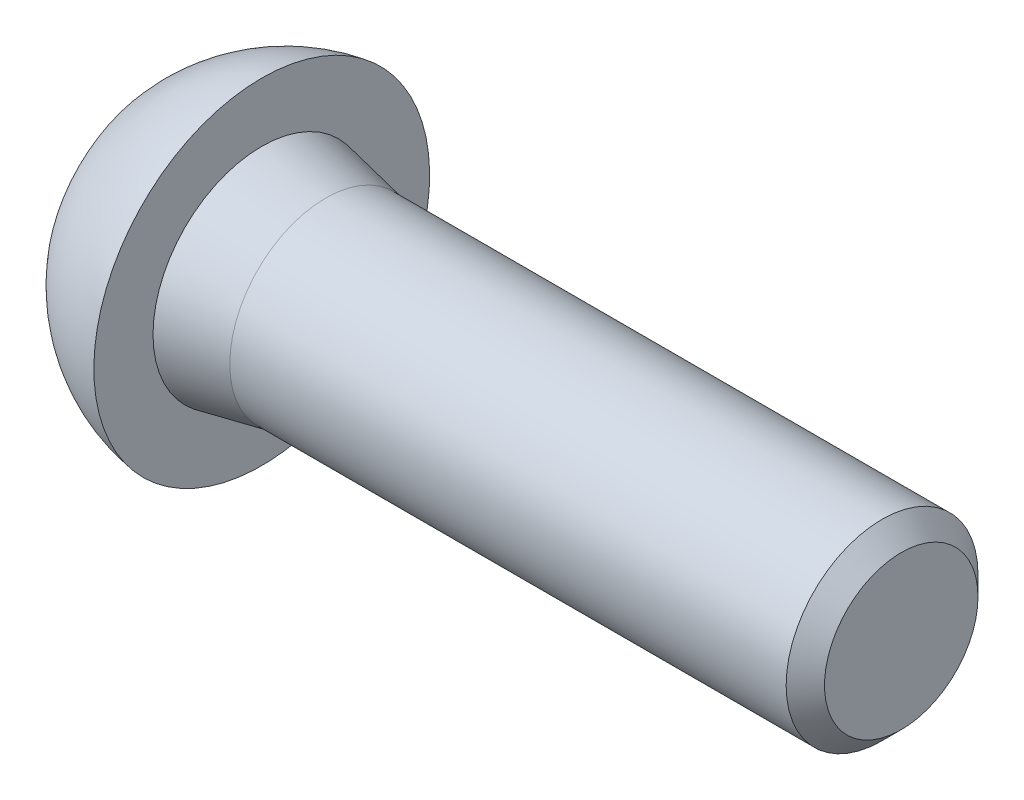
ISO-10303-21;
HEADER;
FILE_DESCRIPTION(('STEP AP214'),'2;1');
FILE_NAME('part.step','',(''),(''),'','','');
FILE_SCHEMA(('AUTOMOTIVE_DESIGN { 1 0 10303 214 1 1 1 1 }'));
ENDSEC;
DATA;
#1=APPLICATION_CONTEXT('core data for automotive mechanical design processes');
#2=APPLICATION_PROTOCOL_DEFINITION('international standard','automotive_design',2000,#1);
#3=PRODUCT_CONTEXT('',#1,'mechanical');
#4=PRODUCT('Part','Part','',(#3));
#5=PRODUCT_RELATED_PRODUCT_CATEGORY('part','',(#4));
#6=PRODUCT_DEFINITION_FORMATION('','',#4);
#7=PRODUCT_DEFINITION_CONTEXT('part definition',#1,'design');
#8=PRODUCT_DEFINITION('design','',#6,#7);
#9=PRODUCT_DEFINITION_SHAPE('','',#8);
#10=(LENGTH_UNIT() NAMED_UNIT(*) SI_UNIT(.MILLI.,.METRE.));
#11=(NAMED_UNIT(*) PLANE_ANGLE_UNIT() SI_UNIT($,.RADIAN.));
#12=(NAMED_UNIT(*) SI_UNIT($,.STERADIAN.) SOLID_ANGLE_UNIT());
#13=UNCERTAINTY_MEASURE_WITH_UNIT(LENGTH_MEASURE(1.E-05),#10,'distance_accuracy_value','');
#14=(GEOMETRIC_REPRESENTATION_CONTEXT(3) GLOBAL_UNCERTAINTY_ASSIGNED_CONTEXT((#13)) GLOBAL_UNIT_ASSIGNED_CONTEXT((#10,
#11,#12)) REPRESENTATION_CONTEXT('',''));
#15=CARTESIAN_POINT('',(0.,0.,0.));
#16=DIRECTION('',(0.,0.,1.));
#17=DIRECTION('',(1.,0.,0.));
#18=AXIS2_PLACEMENT_3D('',#15,#16,#17);
#19=CARTESIAN_POINT('',(0.,0.,0.));
#20=DIRECTION('',(1.,0.,0.));
#21=DIRECTION('',(0.,0.,-1.));
#22=AXIS2_PLACEMENT_3D('',#19,#20,#21);
#23=PLANE('',#22);
#24=CARTESIAN_POINT('',(0.,0.,0.));
#25=DIRECTION('',(1.,0.,0.));
#26=DIRECTION('',(0.,0.,-1.));
#27=AXIS2_PLACEMENT_3D('',#24,#25,#26);
#28=CIRCLE('',#27,2.4);
#29=CARTESIAN_POINT('',(0.,0.,-2.4));
#30=VERTEX_POINT('',#29);
#31=EDGE_CURVE('E62',#30,#30,#28,.T.);
#32=ORIENTED_EDGE('',*,*,#31,.T.);
#33=EDGE_LOOP('',(#32));
#34=FACE_BOUND('',#33,.T.);
#35=ADVANCED_FACE('F51',(#34),#23,.T.);
#36=CARTESIAN_POINT('',(0.,0.,0.));
#37=DIRECTION('',(1.,0.,0.));
#38=DIRECTION('',(0.,0.,-1.));
#39=AXIS2_PLACEMENT_3D('',#36,#37,#38);
#40=CYLINDRICAL_SURFACE('',#39,3.);
#41=CARTESIAN_POINT('',(-0.599999999999997,0.,0.));
#42=DIRECTION('',(1.,0.,0.));
#43=DIRECTION('',(0.,0.,-1.));
#44=AXIS2_PLACEMENT_3D('',#41,#42,#43);
#45=CIRCLE('',#44,3.);
#46=CARTESIAN_POINT('',(-0.599999999999997,0.,-3.));
#47=VERTEX_POINT('',#46);
#48=EDGE_CURVE('E12',#47,#47,#45,.F.);
#49=ORIENTED_EDGE('',*,*,#48,.T.);
#50=EDGE_LOOP('',(#49));
#51=FACE_BOUND('',#50,.T.);
#52=CARTESIAN_POINT('',(-18.,0.,0.));
#53=DIRECTION('',(1.,0.,0.));
#54=DIRECTION('',(0.,0.,-1.));
#55=AXIS2_PLACEMENT_3D('',#52,#53,#54);
#56=CIRCLE('',#55,3.);
#57=CARTESIAN_POINT('',(-18.,0.,-3.));
#58=VERTEX_POINT('',#57);
#59=EDGE_CURVE('E179',#58,#58,#56,.T.);
#60=ORIENTED_EDGE('',*,*,#59,.T.);
#61=EDGE_LOOP('',(#60));
#62=FACE_BOUND('',#61,.T.);
#63=ADVANCED_FACE('F255',(#51,#62),#40,.T.);
#64=CARTESIAN_POINT('',(-18.,0.,0.));
#65=DIRECTION('',(-1.,0.,0.));
#66=DIRECTION('',(0.,0.,1.));
#67=AXIS2_PLACEMENT_3D('',#64,#65,#66);
#68=CONICAL_SURFACE('',#67,3.,0.19739555984988);
#69=CARTESIAN_POINT('',(-20.,0.,0.));
#70=DIRECTION('',(1.,0.,0.));
#71=DIRECTION('',(0.,0.,-1.));
#72=AXIS2_PLACEMENT_3D('',#69,#70,#71);
#73=CIRCLE('',#72,3.4);
#74=CARTESIAN_POINT('',(-20.,0.,-3.4));
#75=VERTEX_POINT('',#74);
#76=EDGE_CURVE('E175',#75,#75,#73,.T.);
#77=ORIENTED_EDGE('',*,*,#76,.T.);
#78=EDGE_LOOP('',(#77));
#79=FACE_BOUND('',#78,.T.);
#80=ORIENTED_EDGE('',*,*,#59,.F.);
#81=EDGE_LOOP('',(#80));
#82=FACE_BOUND('',#81,.T.);
#83=ADVANCED_FACE('F259',(#79,#82),#68,.T.);
#84=CARTESIAN_POINT('',(-20.,3.4,0.));
#85=DIRECTION('',(1.,0.,0.));
#86=DIRECTION('',(0.,0.,-1.));
#87=AXIS2_PLACEMENT_3D('',#84,#85,#86);
#88=PLANE('',#87);
#89=CARTESIAN_POINT('',(-20.,0.,0.));
#90=DIRECTION('',(1.,0.,0.));
#91=DIRECTION('',(0.,0.,-1.));
#92=AXIS2_PLACEMENT_3D('',#89,#90,#91);
#93=CIRCLE('',#92,5.25);
#94=CARTESIAN_POINT('',(-20.,5.25,0.));
#95=VERTEX_POINT('',#94);
#96=EDGE_CURVE('E171',#95,#95,#93,.T.);
#97=ORIENTED_EDGE('',*,*,#96,.T.);
#98=EDGE_LOOP('',(#97));
#99=FACE_BOUND('',#98,.T.);
#100=ORIENTED_EDGE('',*,*,#76,.F.);
#101=EDGE_LOOP('',(#100));
#102=FACE_BOUND('',#101,.T.);
#103=ADVANCED_FACE('F265',(#99,#102),#88,.T.);
#104=CARTESIAN_POINT('',(-19.2460454545454,0.,0.));
#105=DIRECTION('',(1.,0.,0.));
#106=DIRECTION('',(0.,1.,0.));
#107=AXIS2_PLACEMENT_3D('',#104,#105,#106);
#108=SPHERICAL_SURFACE('',#107,5.30386156084523);
#109=CARTESIAN_POINT('',(-23.3,0.,0.));
#110=DIRECTION('',(1.,0.,0.));
#111=DIRECTION('',(0.,0.,-1.));
#112=AXIS2_PLACEMENT_3D('',#109,#110,#111);
#113=CIRCLE('',#112,3.41999999999999);
#114=CARTESIAN_POINT('',(-23.3,3.41999999999999,0.));
#115=VERTEX_POINT('',#114);
#116=EDGE_CURVE('E130',#115,#115,#113,.T.);
#117=CARTESIAN_POINT('',(-23.3,3.41999999999999,0.));
#118=CARTESIAN_POINT('',(-23.2740870694515,3.45071645963646,0.));
#119=CARTESIAN_POINT('',(-23.2478249112314,3.48113829921276,0.));
#120=CARTESIAN_POINT('',(-23.1946159870787,3.5413772668339,0.));
#121=CARTESIAN_POINT('',(-23.1676692211461,3.57119439487874,0.));
#122=CARTESIAN_POINT('',(-23.1131049291991,3.63020846802579,0.));
#123=CARTESIAN_POINT('',(-23.0854874031847,3.65940541312801,0.));
#124=CARTESIAN_POINT('',(-23.0295958800378,3.71716405311965,0.));
#125=CARTESIAN_POINT('',(-23.0013218829053,3.74572574800907,0.));
#126=CARTESIAN_POINT('',(-22.9441320202645,3.80219912608321,0.));
#127=CARTESIAN_POINT('',(-22.9152161547562,3.83011080926792,0.));
#128=CARTESIAN_POINT('',(-22.8567574965401,3.8852697442878,0.));
#129=CARTESIAN_POINT('',(-22.8272147038322,3.91251699612297,0.));
#130=CARTESIAN_POINT('',(-22.7675174544793,3.96633299047506,0.));
#131=CARTESIAN_POINT('',(-22.7373629978344,3.99290173299199,0.));
#132=CARTESIAN_POINT('',(-22.6764580003821,4.04534698173061,0.));
#133=CARTESIAN_POINT('',(-22.6457074595749,4.07122348795232,0.));
#134=CARTESIAN_POINT('',(-22.5836261814162,4.12227089466032,0.));
#135=CARTESIAN_POINT('',(-22.5522954440647,4.14744179514662,0.));
#136=CARTESIAN_POINT('',(-22.4890699602365,4.1970649855345,0.));
#137=CARTESIAN_POINT('',(-22.4571752137598,4.22151727543608,0.));
#138=CARTESIAN_POINT('',(-22.3928381904927,4.26969061107593,0.));
#139=CARTESIAN_POINT('',(-22.3603959137024,4.2934116568142,0.));
#140=CARTESIAN_POINT('',(-22.2949805915108,4.34011024835735,0.));
#141=CARTESIAN_POINT('',(-22.2620075461095,4.36308779416223,0.));
#142=CARTESIAN_POINT('',(-22.1955477226259,4.40828751420635,0.));
#143=CARTESIAN_POINT('',(-22.1620609445435,4.43050968844559,0.));
#144=CARTESIAN_POINT('',(-22.0945909570544,4.47418718399834,0.));
#145=CARTESIAN_POINT('',(-22.0606077476476,4.49564250531186,0.));
#146=CARTESIAN_POINT('',(-21.9921624553533,4.53777520985705,0.));
#147=CARTESIAN_POINT('',(-21.9577003724658,4.55845259308873,0.));
#148=CARTESIAN_POINT('',(-21.8883151384699,4.59901873824546,0.));
#149=CARTESIAN_POINT('',(-21.8533919873614,4.61890750017051,0.));
#150=CARTESIAN_POINT('',(-21.7831026603999,4.65788612694009,0.));
#151=CARTESIAN_POINT('',(-21.7477364845468,4.67697599178461,0.));
#152=CARTESIAN_POINT('',(-21.6765793804665,4.71434696137926,0.));
#153=CARTESIAN_POINT('',(-21.6407884522392,4.73262806612939,0.));
#154=CARTESIAN_POINT('',(-21.5688003352346,4.76837207037724,0.));
#155=CARTESIAN_POINT('',(-21.5326031464572,4.78583496987497,0.));
#156=CARTESIAN_POINT('',(-21.4598212100758,4.81993354119586,0.));
#157=CARTESIAN_POINT('',(-21.4232364624719,4.83656921301902,0.));
#158=CARTESIAN_POINT('',(-21.3496983103979,4.86900473396591,0.));
#159=CARTESIAN_POINT('',(-21.312744905928,4.88480458308965,0.));
#160=CARTESIAN_POINT('',(-21.2384885325538,4.91556029545117,0.));
#161=CARTESIAN_POINT('',(-21.2011855636496,4.93051615868895,0.));
#162=CARTESIAN_POINT('',(-21.1262493344453,4.95957617214685,0.));
#163=CARTESIAN_POINT('',(-21.0886160741452,4.97368032236698,0.));
#164=CARTESIAN_POINT('',(-21.0130387058371,5.0010296227092,0.));
#165=CARTESIAN_POINT('',(-20.9750945978292,5.01427477283129,0.));
#166=CARTESIAN_POINT('',(-20.8989151383947,5.0398992296977,0.));
#167=CARTESIAN_POINT('',(-20.8606797869681,5.05227853644201,0.));
#168=CARTESIAN_POINT('',(-20.783937595468,5.07616491066791,0.));
#169=CARTESIAN_POINT('',(-20.7454307553943,5.0876719781495,0.));
#170=CARTESIAN_POINT('',(-20.6681654816106,5.10980792844589,0.));
#171=CARTESIAN_POINT('',(-20.6294070479005,5.12043681126069,0.));
#172=CARTESIAN_POINT('',(-20.5516586119508,5.14081090118733,0.));
#173=CARTESIAN_POINT('',(-20.5126686097112,5.15055610829917,0.));
#174=CARTESIAN_POINT('',(-20.4344771810517,5.1691578099461,0.));
#175=CARTESIAN_POINT('',(-20.3952757546318,5.17801430448119,0.));
#176=CARTESIAN_POINT('',(-20.3166817326903,5.19483401222037,0.));
#177=CARTESIAN_POINT('',(-20.2772891371688,5.20279722542447,0.));
#178=CARTESIAN_POINT('',(-20.1983331252948,5.21782622985084,0.));
#179=CARTESIAN_POINT('',(-20.1587697089425,5.22489202107312,0.));
#180=CARTESIAN_POINT('',(-20.0794925127506,5.2381226292794,0.));
#181=CARTESIAN_POINT('',(-20.0397787329111,5.24428744626339,0.));
#182=CARTESIAN_POINT('',(-20.,5.25,0.));
#183=B_SPLINE_CURVE_WITH_KNOTS('',3,(#117,#118,#119,#120,#121,#122,#123,#124,#125,#126,#127,
#128,#129,#130,#131,#132,#133,#134,#135,#136,#137,#138,#139,#140,#141,#142,#143,#144,#145,#146,
#147,#148,#149,#150,#151,#152,#153,#154,#155,#156,#157,#158,#159,#160,#161,#162,#163,#164,#165,
#166,#167,#168,#169,#170,#171,#172,#173,#174,#175,#176,#177,#178,#179,#180,#181,#182),
.UNSPECIFIED.,.F.,.F.,(4,2,2,2,2,2,2,2,2,2,2,2,2,2,2,2,2,2,2,2,2,2,2,2,2,2,2,2,2,2,2,2,4),(0.,
0.120557872383614,0.241115744767229,0.361673617150845,0.482231489534458,0.602789361918074,
0.72334723430169,0.843905106685305,0.964462979068921,1.08502085145253,1.20557872383615,
1.32613659621976,1.44669446860338,1.567252340987,1.68781021337061,1.80836808575423,
1.92892595813784,2.04948383052145,2.17004170290507,2.29059957528868,2.4111574476723,
2.53171532005591,2.65227319243953,2.77283106482315,2.89338893720676,3.01394680959038,
3.13450468197399,3.2550625543576,3.37562042674122,3.49617829912484,3.61673617150845,
3.73729404389207,3.85785191627568),.UNSPECIFIED.);
#184=EDGE_CURVE('BSEAM269',#115,#95,#183,.T.);
#185=ORIENTED_EDGE('',*,*,#116,.T.);
#186=ORIENTED_EDGE('',*,*,#96,.F.);
#187=ORIENTED_EDGE('',*,*,#184,.T.);
#188=ORIENTED_EDGE('',*,*,#184,.F.);
#189=EDGE_LOOP('',(#185,#187,#186,#188));
#190=FACE_BOUND('',#189,.T.);
#191=ADVANCED_FACE('F269',(#190),#108,.T.);
#192=CARTESIAN_POINT('',(-23.3,3.42,0.));
#193=DIRECTION('',(-1.,0.,0.));
#194=DIRECTION('',(0.,0.,1.));
#195=AXIS2_PLACEMENT_3D('',#192,#193,#194);
#196=PLANE('',#195);
#197=DIRECTION('',(0.,0.5,-0.866025403784439));
#198=VECTOR('',#197,1.);
#199=CARTESIAN_POINT('',(-23.3,1.15470053837925,2.));
#200=LINE('',#199,#198);
#201=CARTESIAN_POINT('',(-23.3,1.15470053837925,2.));
#202=VERTEX_POINT('',#201);
#203=CARTESIAN_POINT('',(-23.3,2.3094010767585,0.));
#204=VERTEX_POINT('',#203);
#205=EDGE_CURVE('E71',#202,#204,#200,.T.);
#206=ORIENTED_EDGE('',*,*,#205,.F.);
#207=DIRECTION('',(0.,1.,0.));
#208=VECTOR('',#207,1.);
#209=CARTESIAN_POINT('',(-23.3,-1.15470053837925,2.));
#210=LINE('',#209,#208);
#211=CARTESIAN_POINT('',(-23.3,-1.15470053837925,2.));
#212=VERTEX_POINT('',#211);
#213=EDGE_CURVE('E133',#212,#202,#210,.T.);
#214=ORIENTED_EDGE('',*,*,#213,.F.);
#215=DIRECTION('',(0.,0.5,0.866025403784439));
#216=VECTOR('',#215,1.);
#217=CARTESIAN_POINT('',(-23.3,-2.3094010767585,0.));
#218=LINE('',#217,#216);
#219=CARTESIAN_POINT('',(-23.3,-2.3094010767585,0.));
#220=VERTEX_POINT('',#219);
#221=EDGE_CURVE('E138',#220,#212,#218,.T.);
#222=ORIENTED_EDGE('',*,*,#221,.F.);
#223=DIRECTION('',(0.,-0.5,0.866025403784439));
#224=VECTOR('',#223,1.);
#225=CARTESIAN_POINT('',(-23.3,-1.15470053837925,-2.));
#226=LINE('',#225,#224);
#227=CARTESIAN_POINT('',(-23.3,-1.15470053837925,-2.));
#228=VERTEX_POINT('',#227);
#229=EDGE_CURVE('E162',#228,#220,#226,.T.);
#230=ORIENTED_EDGE('',*,*,#229,.F.);
#231=DIRECTION('',(0.,-1.,0.));
#232=VECTOR('',#231,1.);
#233=CARTESIAN_POINT('',(-23.3,1.15470053837925,-2.));
#234=LINE('',#233,#232);
#235=CARTESIAN_POINT('',(-23.3,1.15470053837925,-2.));
#236=VERTEX_POINT('',#235);
#237=EDGE_CURVE('E152',#236,#228,#234,.T.);
#238=ORIENTED_EDGE('',*,*,#237,.F.);
#239=DIRECTION('',(0.,-0.5,-0.866025403784439));
#240=VECTOR('',#239,1.);
#241=CARTESIAN_POINT('',(-23.3,2.3094010767585,0.));
#242=LINE('',#241,#240);
#243=EDGE_CURVE('E145',#204,#236,#242,.T.);
#244=ORIENTED_EDGE('',*,*,#243,.F.);
#245=EDGE_LOOP('',(#206,#214,#222,#230,#238,#244));
#246=FACE_BOUND('',#245,.T.);
#247=ORIENTED_EDGE('',*,*,#116,.F.);
#248=EDGE_LOOP('',(#247));
#249=FACE_BOUND('',#248,.T.);
#250=ADVANCED_FACE('F141',(#246,#249),#196,.T.);
#251=CARTESIAN_POINT('',(-21.22,1.15470053837925,2.));
#252=DIRECTION('',(0.,0.866025403784439,0.5));
#253=DIRECTION('',(0.,-0.5,0.866025403784439));
#254=AXIS2_PLACEMENT_3D('',#251,#252,#253);
#255=PLANE('',#254);
#256=ORIENTED_EDGE('',*,*,#205,.T.);
#257=DIRECTION('',(-1.,0.,0.));
#258=VECTOR('',#257,1.);
#259=CARTESIAN_POINT('',(-21.22,2.3094010767585,0.));
#260=LINE('',#259,#258);
#261=CARTESIAN_POINT('',(-21.22,2.3094010767585,0.));
#262=VERTEX_POINT('',#261);
#263=EDGE_CURVE('E189',#262,#204,#260,.T.);
#264=ORIENTED_EDGE('',*,*,#263,.F.);
#265=DIRECTION('',(0.,-0.5,0.866025403784438));
#266=VECTOR('',#265,1.);
#267=CARTESIAN_POINT('',(-21.22,2.3094010767585,0.));
#268=LINE('',#267,#266);
#269=CARTESIAN_POINT('',(-21.22,1.15470053837925,2.));
#270=VERTEX_POINT('',#269);
#271=EDGE_CURVE('E55',#270,#262,#268,.F.);
#272=ORIENTED_EDGE('',*,*,#271,.F.);
#273=DIRECTION('',(-1.,0.,0.));
#274=VECTOR('',#273,1.);
#275=CARTESIAN_POINT('',(-21.22,1.15470053837925,2.));
#276=LINE('',#275,#274);
#277=EDGE_CURVE('E127',#270,#202,#276,.T.);
#278=ORIENTED_EDGE('',*,*,#277,.T.);
#279=EDGE_LOOP('',(#256,#264,#272,#278));
#280=FACE_BOUND('',#279,.T.);
#281=ADVANCED_FACE('F128',(#280),#255,.F.);
#282=CARTESIAN_POINT('',(-21.22,-1.15470053837925,2.));
#283=DIRECTION('',(0.,0.,1.));
#284=DIRECTION('',(1.,0.,0.));
#285=AXIS2_PLACEMENT_3D('',#282,#283,#284);
#286=PLANE('',#285);
#287=ORIENTED_EDGE('',*,*,#213,.T.);
#288=ORIENTED_EDGE('',*,*,#277,.F.);
#289=DIRECTION('',(0.,1.,0.));
#290=VECTOR('',#289,1.);
#291=CARTESIAN_POINT('',(-21.22,0.,2.));
#292=LINE('',#291,#290);
#293=CARTESIAN_POINT('',(-21.22,-1.15470053837925,2.));
#294=VERTEX_POINT('',#293);
#295=EDGE_CURVE('E95',#294,#270,#292,.T.);
#296=ORIENTED_EDGE('',*,*,#295,.F.);
#297=DIRECTION('',(-1.,0.,0.));
#298=VECTOR('',#297,1.);
#299=CARTESIAN_POINT('',(-21.22,-1.15470053837925,2.));
#300=LINE('',#299,#298);
#301=EDGE_CURVE('E123',#294,#212,#300,.T.);
#302=ORIENTED_EDGE('',*,*,#301,.T.);
#303=EDGE_LOOP('',(#287,#288,#296,#302));
#304=FACE_BOUND('',#303,.T.);
#305=ADVANCED_FACE('F134',(#304),#286,.F.);
#306=CARTESIAN_POINT('',(-21.22,-2.3094010767585,0.));
#307=DIRECTION('',(0.,-0.866025403784439,0.5));
#308=DIRECTION('',(0.,-0.5,-0.866025403784439));
#309=AXIS2_PLACEMENT_3D('',#306,#307,#308);
#310=PLANE('',#309);
#311=ORIENTED_EDGE('',*,*,#221,.T.);
#312=ORIENTED_EDGE('',*,*,#301,.F.);
#313=DIRECTION('',(0.,-0.5,-0.866025403784439));
#314=VECTOR('',#313,1.);
#315=CARTESIAN_POINT('',(-21.22,-1.15470053837925,2.));
#316=LINE('',#315,#314);
#317=CARTESIAN_POINT('',(-21.22,-2.3094010767585,0.));
#318=VERTEX_POINT('',#317);
#319=EDGE_CURVE('E202',#318,#294,#316,.F.);
#320=ORIENTED_EDGE('',*,*,#319,.F.);
#321=DIRECTION('',(-1.,0.,0.));
#322=VECTOR('',#321,1.);
#323=CARTESIAN_POINT('',(-21.22,-2.3094010767585,0.));
#324=LINE('',#323,#322);
#325=EDGE_CURVE('E187',#318,#220,#324,.T.);
#326=ORIENTED_EDGE('',*,*,#325,.T.);
#327=EDGE_LOOP('',(#311,#312,#320,#326));
#328=FACE_BOUND('',#327,.T.);
#329=ADVANCED_FACE('F246',(#328),#310,.F.);
#330=CARTESIAN_POINT('',(-21.22,-1.15470053837925,-2.));
#331=DIRECTION('',(0.,-0.866025403784439,-0.5));
#332=DIRECTION('',(0.,0.5,-0.866025403784439));
#333=AXIS2_PLACEMENT_3D('',#330,#331,#332);
#334=PLANE('',#333);
#335=ORIENTED_EDGE('',*,*,#229,.T.);
#336=ORIENTED_EDGE('',*,*,#325,.F.);
#337=DIRECTION('',(0.,0.500000000000001,-0.866025403784438));
#338=VECTOR('',#337,1.);
#339=CARTESIAN_POINT('',(-21.22,-2.3094010767585,0.));
#340=LINE('',#339,#338);
#341=CARTESIAN_POINT('',(-21.22,-1.15470053837925,-2.));
#342=VERTEX_POINT('',#341);
#343=EDGE_CURVE('E205',#342,#318,#340,.F.);
#344=ORIENTED_EDGE('',*,*,#343,.F.);
#345=DIRECTION('',(-1.,0.,0.));
#346=VECTOR('',#345,1.);
#347=CARTESIAN_POINT('',(-21.22,-1.15470053837925,-2.));
#348=LINE('',#347,#346);
#349=EDGE_CURVE('E195',#342,#228,#348,.T.);
#350=ORIENTED_EDGE('',*,*,#349,.T.);
#351=EDGE_LOOP('',(#335,#336,#344,#350));
#352=FACE_BOUND('',#351,.T.);
#353=ADVANCED_FACE('F243',(#352),#334,.F.);
#354=CARTESIAN_POINT('',(-21.22,1.15470053837925,-2.));
#355=DIRECTION('',(0.,0.,-1.));
#356=DIRECTION('',(-1.,0.,0.));
#357=AXIS2_PLACEMENT_3D('',#354,#355,#356);
#358=PLANE('',#357);
#359=ORIENTED_EDGE('',*,*,#237,.T.);
#360=ORIENTED_EDGE('',*,*,#349,.F.);
#361=DIRECTION('',(0.,1.,0.));
#362=VECTOR('',#361,1.);
#363=CARTESIAN_POINT('',(-21.22,0.,-2.));
#364=LINE('',#363,#362);
#365=CARTESIAN_POINT('',(-21.22,1.15470053837925,-2.));
#366=VERTEX_POINT('',#365);
#367=EDGE_CURVE('E207',#366,#342,#364,.F.);
#368=ORIENTED_EDGE('',*,*,#367,.F.);
#369=DIRECTION('',(-1.,0.,0.));
#370=VECTOR('',#369,1.);
#371=CARTESIAN_POINT('',(-21.22,1.15470053837925,-2.));
#372=LINE('',#371,#370);
#373=EDGE_CURVE('E192',#366,#236,#372,.T.);
#374=ORIENTED_EDGE('',*,*,#373,.T.);
#375=EDGE_LOOP('',(#359,#360,#368,#374));
#376=FACE_BOUND('',#375,.T.);
#377=ADVANCED_FACE('F221',(#376),#358,.F.);
#378=CARTESIAN_POINT('',(-21.22,2.3094010767585,0.));
#379=DIRECTION('',(0.,0.866025403784439,-0.5));
#380=DIRECTION('',(0.,0.5,0.866025403784439));
#381=AXIS2_PLACEMENT_3D('',#378,#379,#380);
#382=PLANE('',#381);
#383=ORIENTED_EDGE('',*,*,#243,.T.);
#384=ORIENTED_EDGE('',*,*,#373,.F.);
#385=DIRECTION('',(0.,0.5,0.866025403784439));
#386=VECTOR('',#385,1.);
#387=CARTESIAN_POINT('',(-21.22,1.15470053837925,-2.));
#388=LINE('',#387,#386);
#389=EDGE_CURVE('E209',#262,#366,#388,.F.);
#390=ORIENTED_EDGE('',*,*,#389,.F.);
#391=ORIENTED_EDGE('',*,*,#263,.T.);
#392=EDGE_LOOP('',(#383,#384,#390,#391));
#393=FACE_BOUND('',#392,.T.);
#394=ADVANCED_FACE('F217',(#393),#382,.F.);
#395=CARTESIAN_POINT('',(0.,0.,0.));
#396=DIRECTION('',(-1.,0.,0.));
#397=DIRECTION('',(0.,0.,1.));
#398=AXIS2_PLACEMENT_3D('',#395,#396,#397);
#399=CONICAL_SURFACE('',#398,2.4,0.785398163397448);
#400=ORIENTED_EDGE('',*,*,#48,.F.);
#401=EDGE_LOOP('',(#400));
#402=FACE_BOUND('',#401,.T.);
#403=ORIENTED_EDGE('',*,*,#31,.F.);
#404=EDGE_LOOP('',(#403));
#405=FACE_BOUND('',#404,.T.);
#406=ADVANCED_FACE('F53',(#402,#405),#399,.T.);
#407=CARTESIAN_POINT('',(-19.958484769006,-3.56493943389456,-2.05821874180374));
#408=DIRECTION('',(-0.979385865114737,-0.174935689354957,-0.100999167339957));
#409=DIRECTION('',(0.175834818906266,-0.984419685124287,0.));
#410=AXIS2_PLACEMENT_3D('',#407,#408,#409);
#411=PLANE('',#410);
#412=DIRECTION('',(-0.175834818906266,0.984419685124287,0.));
#413=VECTOR('',#412,1.);
#414=CARTESIAN_POINT('',(-20.8075,0.,0.));
#415=LINE('',#414,#413);
#416=CARTESIAN_POINT('',(-20.8075,0.,0.));
#417=VERTEX_POINT('',#416);
#418=EDGE_CURVE('E105',#417,#262,#415,.T.);
#419=ORIENTED_EDGE('',*,*,#418,.F.);
#420=DIRECTION('',(-0.175834818906266,0.492209842562143,0.852532455303111));
#421=VECTOR('',#420,1.);
#422=CARTESIAN_POINT('',(-20.8075,0.,0.));
#423=LINE('',#422,#421);
#424=EDGE_CURVE('E147',#417,#270,#423,.T.);
#425=ORIENTED_EDGE('',*,*,#424,.T.);
#426=ORIENTED_EDGE('',*,*,#271,.T.);
#427=EDGE_LOOP('',(#419,#425,#426));
#428=FACE_BOUND('',#427,.T.);
#429=ADVANCED_FACE('F215',(#428),#411,.T.);
#430=CARTESIAN_POINT('',(-19.958484769006,0.,-4.11643748360748));
#431=DIRECTION('',(-0.979385865114737,0.,-0.201998334679914));
#432=DIRECTION('',(-0.201998334679914,0.,0.979385865114737));
#433=AXIS2_PLACEMENT_3D('',#430,#431,#432);
#434=PLANE('',#433);
#435=ORIENTED_EDGE('',*,*,#424,.F.);
#436=DIRECTION('',(-0.175834818906266,-0.492209842562144,0.85253245530311));
#437=VECTOR('',#436,1.);
#438=CARTESIAN_POINT('',(-20.8075,0.,0.));
#439=LINE('',#438,#437);
#440=EDGE_CURVE('E233',#417,#294,#439,.T.);
#441=ORIENTED_EDGE('',*,*,#440,.T.);
#442=ORIENTED_EDGE('',*,*,#295,.T.);
#443=EDGE_LOOP('',(#435,#441,#442));
#444=FACE_BOUND('',#443,.T.);
#445=ADVANCED_FACE('F298',(#444),#434,.T.);
#446=CARTESIAN_POINT('',(-19.958484769006,-3.56493943389456,2.05821874180374));
#447=DIRECTION('',(-0.979385865114737,-0.174935689354957,0.100999167339957));
#448=DIRECTION('',(0.175834818906266,-0.984419685124287,0.));
#449=AXIS2_PLACEMENT_3D('',#446,#447,#448);
#450=PLANE('',#449);
#451=DIRECTION('',(-0.175834818906266,0.492209842562144,-0.85253245530311));
#452=VECTOR('',#451,1.);
#453=CARTESIAN_POINT('',(-20.8075,0.,0.));
#454=LINE('',#453,#452);
#455=EDGE_CURVE('E226',#417,#366,#454,.T.);
#456=ORIENTED_EDGE('',*,*,#455,.F.);
#457=ORIENTED_EDGE('',*,*,#418,.T.);
#458=ORIENTED_EDGE('',*,*,#389,.T.);
#459=EDGE_LOOP('',(#456,#457,#458));
#460=FACE_BOUND('',#459,.T.);
#461=ADVANCED_FACE('F304',(#460),#450,.T.);
#462=CARTESIAN_POINT('',(-19.958484769006,0.,4.11643748360748));
#463=DIRECTION('',(-0.979385865114737,0.,0.201998334679914));
#464=DIRECTION('',(0.201998334679914,0.,0.979385865114737));
#465=AXIS2_PLACEMENT_3D('',#462,#463,#464);
#466=PLANE('',#465);
#467=DIRECTION('',(-0.175834818906267,-0.492209842562143,-0.852532455303111));
#468=VECTOR('',#467,1.);
#469=CARTESIAN_POINT('',(-20.8075,0.,0.));
#470=LINE('',#469,#468);
#471=EDGE_CURVE('E225',#417,#342,#470,.T.);
#472=ORIENTED_EDGE('',*,*,#471,.F.);
#473=ORIENTED_EDGE('',*,*,#455,.T.);
#474=ORIENTED_EDGE('',*,*,#367,.T.);
#475=EDGE_LOOP('',(#472,#473,#474));
#476=FACE_BOUND('',#475,.T.);
#477=ADVANCED_FACE('F224',(#476),#466,.T.);
#478=CARTESIAN_POINT('',(-19.958484769006,3.56493943389456,2.05821874180374));
#479=DIRECTION('',(-0.979385865114737,0.174935689354957,0.100999167339957));
#480=DIRECTION('',(-0.175834818906266,-0.984419685124287,0.));
#481=AXIS2_PLACEMENT_3D('',#478,#479,#480);
#482=PLANE('',#481);
#483=DIRECTION('',(-0.175834818906267,-0.984419685124287,0.));
#484=VECTOR('',#483,1.);
#485=CARTESIAN_POINT('',(-20.8075,0.,0.));
#486=LINE('',#485,#484);
#487=EDGE_CURVE('E111',#417,#318,#486,.T.);
#488=ORIENTED_EDGE('',*,*,#487,.F.);
#489=ORIENTED_EDGE('',*,*,#471,.T.);
#490=ORIENTED_EDGE('',*,*,#343,.T.);
#491=EDGE_LOOP('',(#488,#489,#490));
#492=FACE_BOUND('',#491,.T.);
#493=ADVANCED_FACE('F241',(#492),#482,.T.);
#494=CARTESIAN_POINT('',(-19.958484769006,3.56493943389457,-2.05821874180374));
#495=DIRECTION('',(-0.979385865114737,0.174935689354957,-0.100999167339957));
#496=DIRECTION('',(-0.175834818906266,-0.984419685124287,0.));
#497=AXIS2_PLACEMENT_3D('',#494,#495,#496);
#498=PLANE('',#497);
#499=ORIENTED_EDGE('',*,*,#440,.F.);
#500=ORIENTED_EDGE('',*,*,#487,.T.);
#501=ORIENTED_EDGE('',*,*,#319,.T.);
#502=EDGE_LOOP('',(#499,#500,#501));
#503=FACE_BOUND('',#502,.T.);
#504=ADVANCED_FACE('F238',(#503),#498,.T.);
#505=CLOSED_SHELL('',(#35,#63,#83,#103,#191,#250,#281,#305,#329,#353,#377,#394,#406,#429,#445,
#461,#477,#493,#504));
#506=MANIFOLD_SOLID_BREP('B2',#505);
#507=ADVANCED_BREP_SHAPE_REPRESENTATION('',(#18,#506),#14);
#508=SHAPE_DEFINITION_REPRESENTATION(#9,#507);
ENDSEC;
END-ISO-10303-21;
